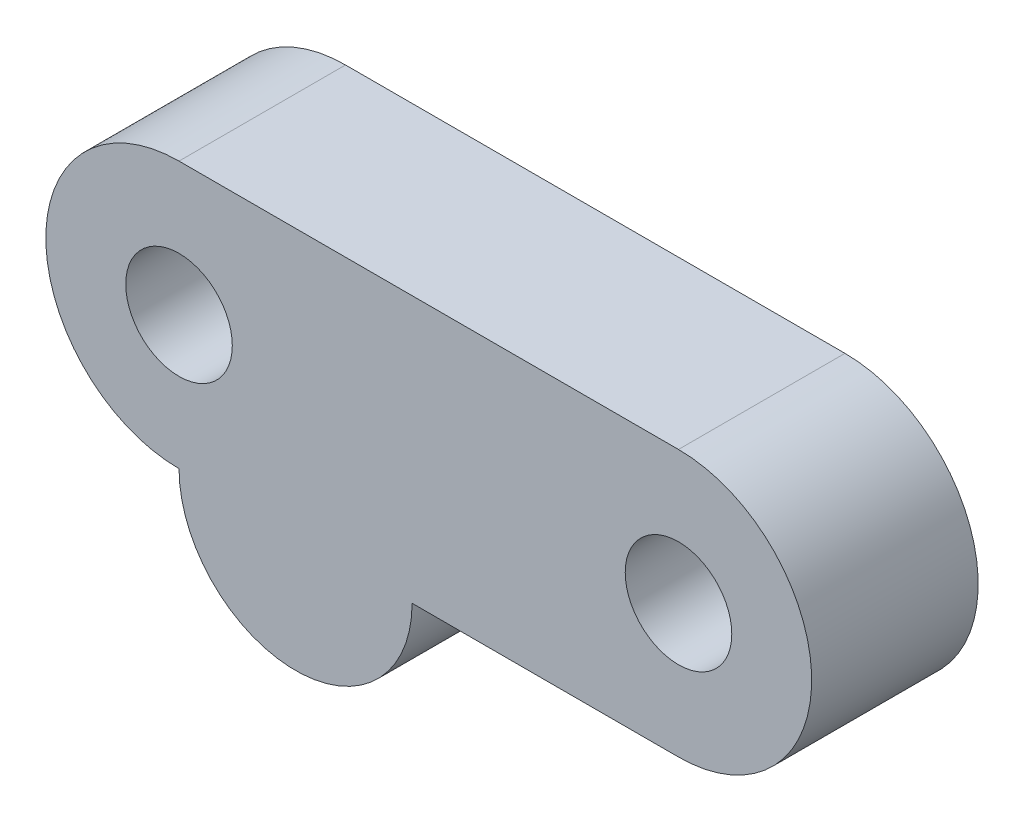
ISO-10303-21;
HEADER;
FILE_DESCRIPTION(('STEP AP214'),'2;1');
FILE_NAME('part.step','',(''),(''),'','','');
FILE_SCHEMA(('AUTOMOTIVE_DESIGN { 1 0 10303 214 1 1 1 1 }'));
ENDSEC;
DATA;
#1=APPLICATION_CONTEXT('core data for automotive mechanical design processes');
#2=APPLICATION_PROTOCOL_DEFINITION('international standard','automotive_design',2000,#1);
#3=PRODUCT_CONTEXT('',#1,'mechanical');
#4=PRODUCT('Part','Part','',(#3));
#5=PRODUCT_RELATED_PRODUCT_CATEGORY('part','',(#4));
#6=PRODUCT_DEFINITION_FORMATION('','',#4);
#7=PRODUCT_DEFINITION_CONTEXT('part definition',#1,'design');
#8=PRODUCT_DEFINITION('design','',#6,#7);
#9=PRODUCT_DEFINITION_SHAPE('','',#8);
#10=(LENGTH_UNIT() NAMED_UNIT(*) SI_UNIT(.MILLI.,.METRE.));
#11=(NAMED_UNIT(*) PLANE_ANGLE_UNIT() SI_UNIT($,.RADIAN.));
#12=(NAMED_UNIT(*) SI_UNIT($,.STERADIAN.) SOLID_ANGLE_UNIT());
#13=UNCERTAINTY_MEASURE_WITH_UNIT(LENGTH_MEASURE(1.E-05),#10,'distance_accuracy_value','');
#14=(GEOMETRIC_REPRESENTATION_CONTEXT(3) GLOBAL_UNCERTAINTY_ASSIGNED_CONTEXT((#13)) GLOBAL_UNIT_ASSIGNED_CONTEXT((#10,
#11,#12)) REPRESENTATION_CONTEXT('',''));
#15=CARTESIAN_POINT('',(0.,0.,0.));
#16=DIRECTION('',(0.,0.,1.));
#17=DIRECTION('',(1.,0.,0.));
#18=AXIS2_PLACEMENT_3D('',#15,#16,#17);
#19=CARTESIAN_POINT('',(0.,0.,5.));
#20=DIRECTION('',(0.,0.,-1.));
#21=DIRECTION('',(-1.,0.,0.));
#22=AXIS2_PLACEMENT_3D('',#19,#20,#21);
#23=CYLINDRICAL_SURFACE('',#22,1.6);
#24=CARTESIAN_POINT('',(0.,0.,5.));
#25=DIRECTION('',(0.,0.,1.));
#26=DIRECTION('',(1.,0.,0.));
#27=AXIS2_PLACEMENT_3D('',#24,#25,#26);
#28=CIRCLE('',#27,1.6);
#29=CARTESIAN_POINT('',(1.6,0.,5.));
#30=VERTEX_POINT('',#29);
#31=EDGE_CURVE('E264',#30,#30,#28,.T.);
#32=ORIENTED_EDGE('',*,*,#31,.T.);
#33=EDGE_LOOP('',(#32));
#34=FACE_BOUND('',#33,.T.);
#35=CARTESIAN_POINT('',(0.,0.,2.));
#36=DIRECTION('',(0.,0.,-1.));
#37=DIRECTION('',(-1.,0.,0.));
#38=AXIS2_PLACEMENT_3D('',#35,#36,#37);
#39=CIRCLE('',#38,1.6);
#40=CARTESIAN_POINT('',(-1.6,0.,2.));
#41=VERTEX_POINT('',#40);
#42=EDGE_CURVE('E43',#41,#41,#39,.T.);
#43=ORIENTED_EDGE('',*,*,#42,.T.);
#44=EDGE_LOOP('',(#43));
#45=FACE_BOUND('',#44,.T.);
#46=ADVANCED_FACE('F39',(#34,#45),#23,.F.);
#47=CARTESIAN_POINT('',(15.,0.,5.));
#48=DIRECTION('',(0.,0.,-1.));
#49=DIRECTION('',(-1.,0.,0.));
#50=AXIS2_PLACEMENT_3D('',#47,#48,#49);
#51=CYLINDRICAL_SURFACE('',#50,1.6);
#52=CARTESIAN_POINT('',(15.,0.,5.));
#53=DIRECTION('',(0.,0.,1.));
#54=DIRECTION('',(1.,0.,0.));
#55=AXIS2_PLACEMENT_3D('',#52,#53,#54);
#56=CIRCLE('',#55,1.6);
#57=CARTESIAN_POINT('',(16.6,0.,5.));
#58=VERTEX_POINT('',#57);
#59=EDGE_CURVE('E261',#58,#58,#56,.T.);
#60=ORIENTED_EDGE('',*,*,#59,.T.);
#61=EDGE_LOOP('',(#60));
#62=FACE_BOUND('',#61,.T.);
#63=CARTESIAN_POINT('',(15.,0.,2.));
#64=DIRECTION('',(0.,0.,-1.));
#65=DIRECTION('',(-1.,0.,0.));
#66=AXIS2_PLACEMENT_3D('',#63,#64,#65);
#67=CIRCLE('',#66,1.6);
#68=CARTESIAN_POINT('',(13.4,0.,2.));
#69=VERTEX_POINT('',#68);
#70=EDGE_CURVE('E207',#69,#69,#67,.T.);
#71=ORIENTED_EDGE('',*,*,#70,.T.);
#72=EDGE_LOOP('',(#71));
#73=FACE_BOUND('',#72,.T.);
#74=ADVANCED_FACE('F364',(#62,#73),#51,.F.);
#75=CARTESIAN_POINT('',(0.,0.,5.));
#76=DIRECTION('',(0.,0.,1.));
#77=DIRECTION('',(1.,0.,0.));
#78=AXIS2_PLACEMENT_3D('',#75,#76,#77);
#79=PLANE('',#78);
#80=ORIENTED_EDGE('',*,*,#31,.F.);
#81=EDGE_LOOP('',(#80));
#82=FACE_BOUND('',#81,.T.);
#83=CARTESIAN_POINT('',(0.,0.,5.));
#84=DIRECTION('',(0.,0.,1.));
#85=DIRECTION('',(1.,0.,0.));
#86=AXIS2_PLACEMENT_3D('',#83,#84,#85);
#87=CIRCLE('',#86,4.);
#88=CARTESIAN_POINT('',(0.,4.,5.));
#89=VERTEX_POINT('',#88);
#90=CARTESIAN_POINT('',(0.,-4.,5.));
#91=VERTEX_POINT('',#90);
#92=EDGE_CURVE('E268',#89,#91,#87,.T.);
#93=ORIENTED_EDGE('',*,*,#92,.T.);
#94=CARTESIAN_POINT('',(3.5,-4.,5.));
#95=DIRECTION('',(0.,0.,1.));
#96=DIRECTION('',(1.,0.,0.));
#97=AXIS2_PLACEMENT_3D('',#94,#95,#96);
#98=CIRCLE('',#97,3.5);
#99=CARTESIAN_POINT('',(7.,-4.,5.));
#100=VERTEX_POINT('',#99);
#101=EDGE_CURVE('E271',#91,#100,#98,.T.);
#102=ORIENTED_EDGE('',*,*,#101,.T.);
#103=DIRECTION('',(1.,0.,0.));
#104=VECTOR('',#103,1.);
#105=CARTESIAN_POINT('',(7.,-4.,5.));
#106=LINE('',#105,#104);
#107=CARTESIAN_POINT('',(15.,-4.,5.));
#108=VERTEX_POINT('',#107);
#109=EDGE_CURVE('E274',#100,#108,#106,.T.);
#110=ORIENTED_EDGE('',*,*,#109,.T.);
#111=CARTESIAN_POINT('',(15.,0.,5.));
#112=DIRECTION('',(0.,0.,1.));
#113=DIRECTION('',(1.,0.,0.));
#114=AXIS2_PLACEMENT_3D('',#111,#112,#113);
#115=CIRCLE('',#114,4.);
#116=CARTESIAN_POINT('',(15.,4.,5.));
#117=VERTEX_POINT('',#116);
#118=EDGE_CURVE('E276',#108,#117,#115,.T.);
#119=ORIENTED_EDGE('',*,*,#118,.T.);
#120=DIRECTION('',(-1.,0.,0.));
#121=VECTOR('',#120,1.);
#122=CARTESIAN_POINT('',(0.,4.,5.));
#123=LINE('',#122,#121);
#124=EDGE_CURVE('E278',#117,#89,#123,.T.);
#125=ORIENTED_EDGE('',*,*,#124,.T.);
#126=EDGE_LOOP('',(#93,#102,#110,#119,#125));
#127=FACE_BOUND('',#126,.T.);
#128=ORIENTED_EDGE('',*,*,#59,.F.);
#129=EDGE_LOOP('',(#128));
#130=FACE_BOUND('',#129,.T.);
#131=ADVANCED_FACE('F336',(#82,#127,#130),#79,.T.);
#132=CARTESIAN_POINT('',(0.,0.,0.));
#133=DIRECTION('',(0.,0.,1.));
#134=DIRECTION('',(1.,0.,0.));
#135=AXIS2_PLACEMENT_3D('',#132,#133,#134);
#136=PLANE('',#135);
#137=DIRECTION('',(0.5,0.866025403784439,0.));
#138=VECTOR('',#137,1.);
#139=CARTESIAN_POINT('',(11.5358983848622,0.,0.));
#140=LINE('',#139,#138);
#141=CARTESIAN_POINT('',(11.5358983848622,0.,0.));
#142=VERTEX_POINT('',#141);
#143=CARTESIAN_POINT('',(13.2679491924311,3.,0.));
#144=VERTEX_POINT('',#143);
#145=EDGE_CURVE('E195',#142,#144,#140,.T.);
#146=ORIENTED_EDGE('',*,*,#145,.F.);
#147=DIRECTION('',(-0.5,0.866025403784439,0.));
#148=VECTOR('',#147,1.);
#149=CARTESIAN_POINT('',(13.2679491924311,-3.,0.));
#150=LINE('',#149,#148);
#151=CARTESIAN_POINT('',(13.2679491924311,-3.,0.));
#152=VERTEX_POINT('',#151);
#153=EDGE_CURVE('E56',#152,#142,#150,.T.);
#154=ORIENTED_EDGE('',*,*,#153,.F.);
#155=DIRECTION('',(-1.,0.,0.));
#156=VECTOR('',#155,1.);
#157=CARTESIAN_POINT('',(16.7320508075689,-3.,0.));
#158=LINE('',#157,#156);
#159=CARTESIAN_POINT('',(16.7320508075689,-3.,0.));
#160=VERTEX_POINT('',#159);
#161=EDGE_CURVE('E181',#160,#152,#158,.T.);
#162=ORIENTED_EDGE('',*,*,#161,.F.);
#163=DIRECTION('',(-0.500000000000001,-0.866025403784438,0.));
#164=VECTOR('',#163,1.);
#165=CARTESIAN_POINT('',(18.4641016151377,0.,0.));
#166=LINE('',#165,#164);
#167=CARTESIAN_POINT('',(18.4641016151377,0.,0.));
#168=VERTEX_POINT('',#167);
#169=EDGE_CURVE('E184',#168,#160,#166,.T.);
#170=ORIENTED_EDGE('',*,*,#169,.F.);
#171=DIRECTION('',(0.500000000000001,-0.866025403784438,0.));
#172=VECTOR('',#171,1.);
#173=CARTESIAN_POINT('',(16.7320508075689,3.,0.));
#174=LINE('',#173,#172);
#175=CARTESIAN_POINT('',(16.7320508075689,3.,0.));
#176=VERTEX_POINT('',#175);
#177=EDGE_CURVE('E200',#176,#168,#174,.T.);
#178=ORIENTED_EDGE('',*,*,#177,.F.);
#179=DIRECTION('',(1.,0.,0.));
#180=VECTOR('',#179,1.);
#181=CARTESIAN_POINT('',(13.2679491924311,3.,0.));
#182=LINE('',#181,#180);
#183=EDGE_CURVE('E197',#144,#176,#182,.T.);
#184=ORIENTED_EDGE('',*,*,#183,.F.);
#185=EDGE_LOOP('',(#146,#154,#162,#170,#178,#184));
#186=FACE_BOUND('',#185,.T.);
#187=DIRECTION('',(0.5,0.866025403784438,0.));
#188=VECTOR('',#187,1.);
#189=CARTESIAN_POINT('',(-3.46410161513775,0.,0.));
#190=LINE('',#189,#188);
#191=CARTESIAN_POINT('',(-3.46410161513775,0.,0.));
#192=VERTEX_POINT('',#191);
#193=CARTESIAN_POINT('',(-1.73205080756888,3.,0.));
#194=VERTEX_POINT('',#193);
#195=EDGE_CURVE('E241',#192,#194,#190,.T.);
#196=ORIENTED_EDGE('',*,*,#195,.F.);
#197=DIRECTION('',(-0.5,0.866025403784439,0.));
#198=VECTOR('',#197,1.);
#199=CARTESIAN_POINT('',(-1.73205080756888,-3.,0.));
#200=LINE('',#199,#198);
#201=CARTESIAN_POINT('',(-1.73205080756888,-3.,0.));
#202=VERTEX_POINT('',#201);
#203=EDGE_CURVE('E64',#202,#192,#200,.T.);
#204=ORIENTED_EDGE('',*,*,#203,.F.);
#205=DIRECTION('',(-1.,0.,0.));
#206=VECTOR('',#205,1.);
#207=CARTESIAN_POINT('',(1.73205080756888,-3.,0.));
#208=LINE('',#207,#206);
#209=CARTESIAN_POINT('',(1.73205080756888,-3.,0.));
#210=VERTEX_POINT('',#209);
#211=EDGE_CURVE('E228',#210,#202,#208,.T.);
#212=ORIENTED_EDGE('',*,*,#211,.F.);
#213=DIRECTION('',(-0.5,-0.866025403784438,0.));
#214=VECTOR('',#213,1.);
#215=CARTESIAN_POINT('',(3.46410161513776,0.,0.));
#216=LINE('',#215,#214);
#217=CARTESIAN_POINT('',(3.46410161513776,0.,0.));
#218=VERTEX_POINT('',#217);
#219=EDGE_CURVE('E231',#218,#210,#216,.T.);
#220=ORIENTED_EDGE('',*,*,#219,.F.);
#221=DIRECTION('',(0.5,-0.866025403784439,0.));
#222=VECTOR('',#221,1.);
#223=CARTESIAN_POINT('',(1.73205080756888,3.,0.));
#224=LINE('',#223,#222);
#225=CARTESIAN_POINT('',(1.73205080756888,3.,0.));
#226=VERTEX_POINT('',#225);
#227=EDGE_CURVE('E235',#226,#218,#224,.T.);
#228=ORIENTED_EDGE('',*,*,#227,.F.);
#229=DIRECTION('',(1.,0.,0.));
#230=VECTOR('',#229,1.);
#231=CARTESIAN_POINT('',(-1.73205080756888,3.,0.));
#232=LINE('',#231,#230);
#233=EDGE_CURVE('E238',#194,#226,#232,.T.);
#234=ORIENTED_EDGE('',*,*,#233,.F.);
#235=EDGE_LOOP('',(#196,#204,#212,#220,#228,#234));
#236=FACE_BOUND('',#235,.T.);
#237=CARTESIAN_POINT('',(0.,0.,0.));
#238=DIRECTION('',(0.,0.,1.));
#239=DIRECTION('',(1.,0.,0.));
#240=AXIS2_PLACEMENT_3D('',#237,#238,#239);
#241=CIRCLE('',#240,4.);
#242=CARTESIAN_POINT('',(0.,4.,0.));
#243=VERTEX_POINT('',#242);
#244=CARTESIAN_POINT('',(0.,-4.,0.));
#245=VERTEX_POINT('',#244);
#246=EDGE_CURVE('E267',#243,#245,#241,.T.);
#247=ORIENTED_EDGE('',*,*,#246,.F.);
#248=DIRECTION('',(-1.,0.,0.));
#249=VECTOR('',#248,1.);
#250=CARTESIAN_POINT('',(0.,4.,0.));
#251=LINE('',#250,#249);
#252=CARTESIAN_POINT('',(15.,4.,0.));
#253=VERTEX_POINT('',#252);
#254=EDGE_CURVE('E272',#253,#243,#251,.T.);
#255=ORIENTED_EDGE('',*,*,#254,.F.);
#256=CARTESIAN_POINT('',(15.,0.,0.));
#257=DIRECTION('',(0.,0.,1.));
#258=DIRECTION('',(1.,0.,0.));
#259=AXIS2_PLACEMENT_3D('',#256,#257,#258);
#260=CIRCLE('',#259,4.);
#261=CARTESIAN_POINT('',(15.,-4.,0.));
#262=VERTEX_POINT('',#261);
#263=EDGE_CURVE('E287',#262,#253,#260,.T.);
#264=ORIENTED_EDGE('',*,*,#263,.F.);
#265=DIRECTION('',(1.,0.,0.));
#266=VECTOR('',#265,1.);
#267=CARTESIAN_POINT('',(7.,-4.,0.));
#268=LINE('',#267,#266);
#269=CARTESIAN_POINT('',(7.,-4.,0.));
#270=VERTEX_POINT('',#269);
#271=EDGE_CURVE('E285',#270,#262,#268,.T.);
#272=ORIENTED_EDGE('',*,*,#271,.F.);
#273=CARTESIAN_POINT('',(3.5,-4.,0.));
#274=DIRECTION('',(0.,0.,1.));
#275=DIRECTION('',(1.,0.,0.));
#276=AXIS2_PLACEMENT_3D('',#273,#274,#275);
#277=CIRCLE('',#276,3.5);
#278=EDGE_CURVE('E283',#245,#270,#277,.T.);
#279=ORIENTED_EDGE('',*,*,#278,.F.);
#280=EDGE_LOOP('',(#247,#255,#264,#272,#279));
#281=FACE_BOUND('',#280,.T.);
#282=ADVANCED_FACE('F333',(#186,#236,#281),#136,.F.);
#283=CARTESIAN_POINT('',(0.,0.,5.));
#284=DIRECTION('',(0.,0.,-1.));
#285=DIRECTION('',(-1.,0.,0.));
#286=AXIS2_PLACEMENT_3D('',#283,#284,#285);
#287=CYLINDRICAL_SURFACE('',#286,4.);
#288=ORIENTED_EDGE('',*,*,#246,.T.);
#289=DIRECTION('',(0.,0.,-1.));
#290=VECTOR('',#289,1.);
#291=CARTESIAN_POINT('',(0.,-4.,5.));
#292=LINE('',#291,#290);
#293=EDGE_CURVE('E11',#91,#245,#292,.T.);
#294=ORIENTED_EDGE('',*,*,#293,.F.);
#295=ORIENTED_EDGE('',*,*,#92,.F.);
#296=DIRECTION('',(0.,0.,-1.));
#297=VECTOR('',#296,1.);
#298=CARTESIAN_POINT('',(0.,4.,5.));
#299=LINE('',#298,#297);
#300=EDGE_CURVE('E280',#89,#243,#299,.T.);
#301=ORIENTED_EDGE('',*,*,#300,.T.);
#302=EDGE_LOOP('',(#288,#294,#295,#301));
#303=FACE_BOUND('',#302,.T.);
#304=ADVANCED_FACE('F41',(#303),#287,.T.);
#305=CARTESIAN_POINT('',(3.5,-4.,5.));
#306=DIRECTION('',(0.,0.,-1.));
#307=DIRECTION('',(-1.,0.,0.));
#308=AXIS2_PLACEMENT_3D('',#305,#306,#307);
#309=CYLINDRICAL_SURFACE('',#308,3.5);
#310=ORIENTED_EDGE('',*,*,#278,.T.);
#311=DIRECTION('',(0.,0.,-1.));
#312=VECTOR('',#311,1.);
#313=CARTESIAN_POINT('',(7.,-4.,5.));
#314=LINE('',#313,#312);
#315=EDGE_CURVE('E48',#100,#270,#314,.T.);
#316=ORIENTED_EDGE('',*,*,#315,.F.);
#317=ORIENTED_EDGE('',*,*,#101,.F.);
#318=ORIENTED_EDGE('',*,*,#293,.T.);
#319=EDGE_LOOP('',(#310,#316,#317,#318));
#320=FACE_BOUND('',#319,.T.);
#321=ADVANCED_FACE('F360',(#320),#309,.T.);
#322=CARTESIAN_POINT('',(7.,-4.,5.));
#323=DIRECTION('',(0.,1.,0.));
#324=DIRECTION('',(0.,0.,1.));
#325=AXIS2_PLACEMENT_3D('',#322,#323,#324);
#326=PLANE('',#325);
#327=ORIENTED_EDGE('',*,*,#271,.T.);
#328=DIRECTION('',(0.,0.,-1.));
#329=VECTOR('',#328,1.);
#330=CARTESIAN_POINT('',(15.,-4.,5.));
#331=LINE('',#330,#329);
#332=EDGE_CURVE('E295',#108,#262,#331,.T.);
#333=ORIENTED_EDGE('',*,*,#332,.F.);
#334=ORIENTED_EDGE('',*,*,#109,.F.);
#335=ORIENTED_EDGE('',*,*,#315,.T.);
#336=EDGE_LOOP('',(#327,#333,#334,#335));
#337=FACE_BOUND('',#336,.T.);
#338=ADVANCED_FACE('F356',(#337),#326,.F.);
#339=CARTESIAN_POINT('',(15.,0.,5.));
#340=DIRECTION('',(0.,0.,-1.));
#341=DIRECTION('',(-1.,0.,0.));
#342=AXIS2_PLACEMENT_3D('',#339,#340,#341);
#343=CYLINDRICAL_SURFACE('',#342,4.);
#344=ORIENTED_EDGE('',*,*,#263,.T.);
#345=DIRECTION('',(0.,0.,-1.));
#346=VECTOR('',#345,1.);
#347=CARTESIAN_POINT('',(15.,4.,5.));
#348=LINE('',#347,#346);
#349=EDGE_CURVE('E292',#117,#253,#348,.T.);
#350=ORIENTED_EDGE('',*,*,#349,.F.);
#351=ORIENTED_EDGE('',*,*,#118,.F.);
#352=ORIENTED_EDGE('',*,*,#332,.T.);
#353=EDGE_LOOP('',(#344,#350,#351,#352));
#354=FACE_BOUND('',#353,.T.);
#355=ADVANCED_FACE('F353',(#354),#343,.T.);
#356=CARTESIAN_POINT('',(0.,4.,5.));
#357=DIRECTION('',(0.,-1.,0.));
#358=DIRECTION('',(0.,0.,-1.));
#359=AXIS2_PLACEMENT_3D('',#356,#357,#358);
#360=PLANE('',#359);
#361=ORIENTED_EDGE('',*,*,#254,.T.);
#362=ORIENTED_EDGE('',*,*,#300,.F.);
#363=ORIENTED_EDGE('',*,*,#124,.F.);
#364=ORIENTED_EDGE('',*,*,#349,.T.);
#365=EDGE_LOOP('',(#361,#362,#363,#364));
#366=FACE_BOUND('',#365,.T.);
#367=ADVANCED_FACE('F349',(#366),#360,.F.);
#368=CARTESIAN_POINT('',(13.2679491924311,-3.,2.));
#369=DIRECTION('',(-0.866025403784439,-0.5,0.));
#370=DIRECTION('',(0.5,-0.866025403784439,0.));
#371=AXIS2_PLACEMENT_3D('',#368,#369,#370);
#372=PLANE('',#371);
#373=ORIENTED_EDGE('',*,*,#153,.T.);
#374=DIRECTION('',(0.,0.,-1.));
#375=VECTOR('',#374,1.);
#376=CARTESIAN_POINT('',(11.5358983848622,0.,2.));
#377=LINE('',#376,#375);
#378=CARTESIAN_POINT('',(11.5358983848622,0.,2.));
#379=VERTEX_POINT('',#378);
#380=EDGE_CURVE('E158',#379,#142,#377,.T.);
#381=ORIENTED_EDGE('',*,*,#380,.F.);
#382=DIRECTION('',(-0.5,0.866025403784439,0.));
#383=VECTOR('',#382,1.);
#384=CARTESIAN_POINT('',(13.2679491924311,-3.,2.));
#385=LINE('',#384,#383);
#386=CARTESIAN_POINT('',(13.2679491924311,-3.,2.));
#387=VERTEX_POINT('',#386);
#388=EDGE_CURVE('E162',#387,#379,#385,.T.);
#389=ORIENTED_EDGE('',*,*,#388,.F.);
#390=DIRECTION('',(0.,0.,-1.));
#391=VECTOR('',#390,1.);
#392=CARTESIAN_POINT('',(13.2679491924311,-3.,2.));
#393=LINE('',#392,#391);
#394=EDGE_CURVE('E205',#387,#152,#393,.T.);
#395=ORIENTED_EDGE('',*,*,#394,.T.);
#396=EDGE_LOOP('',(#373,#381,#389,#395));
#397=FACE_BOUND('',#396,.T.);
#398=ADVANCED_FACE('F160',(#397),#372,.F.);
#399=CARTESIAN_POINT('',(16.7320508075689,-3.,2.));
#400=DIRECTION('',(0.,-1.,0.));
#401=DIRECTION('',(0.,0.,-1.));
#402=AXIS2_PLACEMENT_3D('',#399,#400,#401);
#403=PLANE('',#402);
#404=ORIENTED_EDGE('',*,*,#161,.T.);
#405=ORIENTED_EDGE('',*,*,#394,.F.);
#406=DIRECTION('',(-1.,0.,0.));
#407=VECTOR('',#406,1.);
#408=CARTESIAN_POINT('',(16.7320508075689,-3.,2.));
#409=LINE('',#408,#407);
#410=CARTESIAN_POINT('',(16.7320508075689,-3.,2.));
#411=VERTEX_POINT('',#410);
#412=EDGE_CURVE('E168',#411,#387,#409,.T.);
#413=ORIENTED_EDGE('',*,*,#412,.F.);
#414=DIRECTION('',(0.,0.,-1.));
#415=VECTOR('',#414,1.);
#416=CARTESIAN_POINT('',(16.7320508075689,-3.,2.));
#417=LINE('',#416,#415);
#418=EDGE_CURVE('E208',#411,#160,#417,.T.);
#419=ORIENTED_EDGE('',*,*,#418,.T.);
#420=EDGE_LOOP('',(#404,#405,#413,#419));
#421=FACE_BOUND('',#420,.T.);
#422=ADVANCED_FACE('F408',(#421),#403,.F.);
#423=CARTESIAN_POINT('',(18.4641016151377,0.,2.));
#424=DIRECTION('',(0.866025403784438,-0.500000000000001,0.));
#425=DIRECTION('',(0.500000000000001,0.866025403784438,0.));
#426=AXIS2_PLACEMENT_3D('',#423,#424,#425);
#427=PLANE('',#426);
#428=ORIENTED_EDGE('',*,*,#169,.T.);
#429=ORIENTED_EDGE('',*,*,#418,.F.);
#430=DIRECTION('',(-0.500000000000001,-0.866025403784438,0.));
#431=VECTOR('',#430,1.);
#432=CARTESIAN_POINT('',(18.4641016151377,0.,2.));
#433=LINE('',#432,#431);
#434=CARTESIAN_POINT('',(18.4641016151377,0.,2.));
#435=VERTEX_POINT('',#434);
#436=EDGE_CURVE('E191',#435,#411,#433,.T.);
#437=ORIENTED_EDGE('',*,*,#436,.F.);
#438=DIRECTION('',(0.,0.,-1.));
#439=VECTOR('',#438,1.);
#440=CARTESIAN_POINT('',(18.4641016151377,0.,2.));
#441=LINE('',#440,#439);
#442=EDGE_CURVE('E210',#435,#168,#441,.T.);
#443=ORIENTED_EDGE('',*,*,#442,.T.);
#444=EDGE_LOOP('',(#428,#429,#437,#443));
#445=FACE_BOUND('',#444,.T.);
#446=ADVANCED_FACE('F417',(#445),#427,.F.);
#447=CARTESIAN_POINT('',(16.7320508075689,3.,2.));
#448=DIRECTION('',(0.866025403784438,0.500000000000001,0.));
#449=DIRECTION('',(-0.500000000000001,0.866025403784438,0.));
#450=AXIS2_PLACEMENT_3D('',#447,#448,#449);
#451=PLANE('',#450);
#452=ORIENTED_EDGE('',*,*,#177,.T.);
#453=ORIENTED_EDGE('',*,*,#442,.F.);
#454=DIRECTION('',(0.500000000000001,-0.866025403784438,0.));
#455=VECTOR('',#454,1.);
#456=CARTESIAN_POINT('',(16.7320508075689,3.,2.));
#457=LINE('',#456,#455);
#458=CARTESIAN_POINT('',(16.7320508075689,3.,2.));
#459=VERTEX_POINT('',#458);
#460=EDGE_CURVE('E188',#459,#435,#457,.T.);
#461=ORIENTED_EDGE('',*,*,#460,.F.);
#462=DIRECTION('',(0.,0.,-1.));
#463=VECTOR('',#462,1.);
#464=CARTESIAN_POINT('',(16.7320508075689,3.,2.));
#465=LINE('',#464,#463);
#466=EDGE_CURVE('E212',#459,#176,#465,.T.);
#467=ORIENTED_EDGE('',*,*,#466,.T.);
#468=EDGE_LOOP('',(#452,#453,#461,#467));
#469=FACE_BOUND('',#468,.T.);
#470=ADVANCED_FACE('F426',(#469),#451,.F.);
#471=CARTESIAN_POINT('',(13.2679491924311,3.,2.));
#472=DIRECTION('',(0.,1.,0.));
#473=DIRECTION('',(-1.,0.,0.));
#474=AXIS2_PLACEMENT_3D('',#471,#472,#473);
#475=PLANE('',#474);
#476=ORIENTED_EDGE('',*,*,#183,.T.);
#477=ORIENTED_EDGE('',*,*,#466,.F.);
#478=DIRECTION('',(1.,0.,0.));
#479=VECTOR('',#478,1.);
#480=CARTESIAN_POINT('',(13.2679491924311,3.,2.));
#481=LINE('',#480,#479);
#482=CARTESIAN_POINT('',(13.2679491924311,3.,2.));
#483=VERTEX_POINT('',#482);
#484=EDGE_CURVE('E176',#483,#459,#481,.T.);
#485=ORIENTED_EDGE('',*,*,#484,.F.);
#486=DIRECTION('',(0.,0.,-1.));
#487=VECTOR('',#486,1.);
#488=CARTESIAN_POINT('',(13.2679491924311,3.,2.));
#489=LINE('',#488,#487);
#490=EDGE_CURVE('E167',#483,#144,#489,.T.);
#491=ORIENTED_EDGE('',*,*,#490,.T.);
#492=EDGE_LOOP('',(#476,#477,#485,#491));
#493=FACE_BOUND('',#492,.T.);
#494=ADVANCED_FACE('F435',(#493),#475,.F.);
#495=CARTESIAN_POINT('',(11.5358983848622,0.,2.));
#496=DIRECTION('',(-0.866025403784439,0.5,0.));
#497=DIRECTION('',(-0.5,-0.866025403784439,0.));
#498=AXIS2_PLACEMENT_3D('',#495,#496,#497);
#499=PLANE('',#498);
#500=ORIENTED_EDGE('',*,*,#145,.T.);
#501=ORIENTED_EDGE('',*,*,#490,.F.);
#502=DIRECTION('',(0.5,0.866025403784439,0.));
#503=VECTOR('',#502,1.);
#504=CARTESIAN_POINT('',(11.5358983848622,0.,2.));
#505=LINE('',#504,#503);
#506=EDGE_CURVE('E171',#379,#483,#505,.T.);
#507=ORIENTED_EDGE('',*,*,#506,.F.);
#508=ORIENTED_EDGE('',*,*,#380,.T.);
#509=EDGE_LOOP('',(#500,#501,#507,#508));
#510=FACE_BOUND('',#509,.T.);
#511=ADVANCED_FACE('F172',(#510),#499,.F.);
#512=CARTESIAN_POINT('',(0.,0.,2.));
#513=DIRECTION('',(0.,0.,-1.));
#514=DIRECTION('',(-1.,0.,0.));
#515=AXIS2_PLACEMENT_3D('',#512,#513,#514);
#516=PLANE('',#515);
#517=ORIENTED_EDGE('',*,*,#70,.F.);
#518=EDGE_LOOP('',(#517));
#519=FACE_BOUND('',#518,.T.);
#520=ORIENTED_EDGE('',*,*,#388,.T.);
#521=ORIENTED_EDGE('',*,*,#506,.T.);
#522=ORIENTED_EDGE('',*,*,#484,.T.);
#523=ORIENTED_EDGE('',*,*,#460,.T.);
#524=ORIENTED_EDGE('',*,*,#436,.T.);
#525=ORIENTED_EDGE('',*,*,#412,.T.);
#526=EDGE_LOOP('',(#520,#521,#522,#523,#524,#525));
#527=FACE_BOUND('',#526,.T.);
#528=ADVANCED_FACE('F178',(#519,#527),#516,.T.);
#529=CARTESIAN_POINT('',(-1.73205080756888,-3.,2.));
#530=DIRECTION('',(-0.866025403784439,-0.5,0.));
#531=DIRECTION('',(0.5,-0.866025403784439,0.));
#532=AXIS2_PLACEMENT_3D('',#529,#530,#531);
#533=PLANE('',#532);
#534=ORIENTED_EDGE('',*,*,#203,.T.);
#535=DIRECTION('',(0.,0.,-1.));
#536=VECTOR('',#535,1.);
#537=CARTESIAN_POINT('',(-3.46410161513775,0.,2.));
#538=LINE('',#537,#536);
#539=CARTESIAN_POINT('',(-3.46410161513775,0.,2.));
#540=VERTEX_POINT('',#539);
#541=EDGE_CURVE('E215',#540,#192,#538,.T.);
#542=ORIENTED_EDGE('',*,*,#541,.F.);
#543=DIRECTION('',(-0.5,0.866025403784439,0.));
#544=VECTOR('',#543,1.);
#545=CARTESIAN_POINT('',(-1.73205080756888,-3.,2.));
#546=LINE('',#545,#544);
#547=CARTESIAN_POINT('',(-1.73205080756888,-3.,2.));
#548=VERTEX_POINT('',#547);
#549=EDGE_CURVE('E232',#548,#540,#546,.T.);
#550=ORIENTED_EDGE('',*,*,#549,.F.);
#551=DIRECTION('',(0.,0.,-1.));
#552=VECTOR('',#551,1.);
#553=CARTESIAN_POINT('',(-1.73205080756888,-3.,2.));
#554=LINE('',#553,#552);
#555=EDGE_CURVE('E226',#548,#202,#554,.T.);
#556=ORIENTED_EDGE('',*,*,#555,.T.);
#557=EDGE_LOOP('',(#534,#542,#550,#556));
#558=FACE_BOUND('',#557,.T.);
#559=ADVANCED_FACE('F314',(#558),#533,.F.);
#560=CARTESIAN_POINT('',(1.73205080756888,-3.,2.));
#561=DIRECTION('',(0.,-1.,0.));
#562=DIRECTION('',(1.,0.,0.));
#563=AXIS2_PLACEMENT_3D('',#560,#561,#562);
#564=PLANE('',#563);
#565=ORIENTED_EDGE('',*,*,#211,.T.);
#566=ORIENTED_EDGE('',*,*,#555,.F.);
#567=DIRECTION('',(-1.,0.,0.));
#568=VECTOR('',#567,1.);
#569=CARTESIAN_POINT('',(1.73205080756888,-3.,2.));
#570=LINE('',#569,#568);
#571=CARTESIAN_POINT('',(1.73205080756888,-3.,2.));
#572=VERTEX_POINT('',#571);
#573=EDGE_CURVE('E217',#572,#548,#570,.T.);
#574=ORIENTED_EDGE('',*,*,#573,.F.);
#575=DIRECTION('',(0.,0.,-1.));
#576=VECTOR('',#575,1.);
#577=CARTESIAN_POINT('',(1.73205080756888,-3.,2.));
#578=LINE('',#577,#576);
#579=EDGE_CURVE('E224',#572,#210,#578,.T.);
#580=ORIENTED_EDGE('',*,*,#579,.T.);
#581=EDGE_LOOP('',(#565,#566,#574,#580));
#582=FACE_BOUND('',#581,.T.);
#583=ADVANCED_FACE('F331',(#582),#564,.F.);
#584=CARTESIAN_POINT('',(3.46410161513776,0.,2.));
#585=DIRECTION('',(0.866025403784439,-0.5,0.));
#586=DIRECTION('',(0.5,0.866025403784438,0.));
#587=AXIS2_PLACEMENT_3D('',#584,#585,#586);
#588=PLANE('',#587);
#589=ORIENTED_EDGE('',*,*,#219,.T.);
#590=ORIENTED_EDGE('',*,*,#579,.F.);
#591=DIRECTION('',(-0.5,-0.866025403784438,0.));
#592=VECTOR('',#591,1.);
#593=CARTESIAN_POINT('',(3.46410161513776,0.,2.));
#594=LINE('',#593,#592);
#595=CARTESIAN_POINT('',(3.46410161513776,0.,2.));
#596=VERTEX_POINT('',#595);
#597=EDGE_CURVE('E247',#596,#572,#594,.T.);
#598=ORIENTED_EDGE('',*,*,#597,.F.);
#599=DIRECTION('',(0.,0.,-1.));
#600=VECTOR('',#599,1.);
#601=CARTESIAN_POINT('',(3.46410161513776,0.,2.));
#602=LINE('',#601,#600);
#603=EDGE_CURVE('E222',#596,#218,#602,.T.);
#604=ORIENTED_EDGE('',*,*,#603,.T.);
#605=EDGE_LOOP('',(#589,#590,#598,#604));
#606=FACE_BOUND('',#605,.T.);
#607=ADVANCED_FACE('F328',(#606),#588,.F.);
#608=CARTESIAN_POINT('',(1.73205080756888,3.,2.));
#609=DIRECTION('',(0.866025403784439,0.5,0.));
#610=DIRECTION('',(-0.5,0.866025403784439,0.));
#611=AXIS2_PLACEMENT_3D('',#608,#609,#610);
#612=PLANE('',#611);
#613=ORIENTED_EDGE('',*,*,#227,.T.);
#614=ORIENTED_EDGE('',*,*,#603,.F.);
#615=DIRECTION('',(0.5,-0.866025403784439,0.));
#616=VECTOR('',#615,1.);
#617=CARTESIAN_POINT('',(1.73205080756888,3.,2.));
#618=LINE('',#617,#616);
#619=CARTESIAN_POINT('',(1.73205080756888,3.,2.));
#620=VERTEX_POINT('',#619);
#621=EDGE_CURVE('E250',#620,#596,#618,.T.);
#622=ORIENTED_EDGE('',*,*,#621,.F.);
#623=DIRECTION('',(0.,0.,-1.));
#624=VECTOR('',#623,1.);
#625=CARTESIAN_POINT('',(1.73205080756888,3.,2.));
#626=LINE('',#625,#624);
#627=EDGE_CURVE('E220',#620,#226,#626,.T.);
#628=ORIENTED_EDGE('',*,*,#627,.T.);
#629=EDGE_LOOP('',(#613,#614,#622,#628));
#630=FACE_BOUND('',#629,.T.);
#631=ADVANCED_FACE('F324',(#630),#612,.F.);
#632=CARTESIAN_POINT('',(-1.73205080756888,3.,2.));
#633=DIRECTION('',(0.,1.,0.));
#634=DIRECTION('',(-1.,0.,0.));
#635=AXIS2_PLACEMENT_3D('',#632,#633,#634);
#636=PLANE('',#635);
#637=ORIENTED_EDGE('',*,*,#233,.T.);
#638=ORIENTED_EDGE('',*,*,#627,.F.);
#639=DIRECTION('',(1.,0.,0.));
#640=VECTOR('',#639,1.);
#641=CARTESIAN_POINT('',(-1.73205080756888,3.,2.));
#642=LINE('',#641,#640);
#643=CARTESIAN_POINT('',(-1.73205080756888,3.,2.));
#644=VERTEX_POINT('',#643);
#645=EDGE_CURVE('E253',#644,#620,#642,.T.);
#646=ORIENTED_EDGE('',*,*,#645,.F.);
#647=DIRECTION('',(0.,0.,-1.));
#648=VECTOR('',#647,1.);
#649=CARTESIAN_POINT('',(-1.73205080756888,3.,2.));
#650=LINE('',#649,#648);
#651=EDGE_CURVE('E218',#644,#194,#650,.T.);
#652=ORIENTED_EDGE('',*,*,#651,.T.);
#653=EDGE_LOOP('',(#637,#638,#646,#652));
#654=FACE_BOUND('',#653,.T.);
#655=ADVANCED_FACE('F320',(#654),#636,.F.);
#656=CARTESIAN_POINT('',(-3.46410161513775,0.,2.));
#657=DIRECTION('',(-0.866025403784438,0.5,0.));
#658=DIRECTION('',(-0.5,-0.866025403784439,0.));
#659=AXIS2_PLACEMENT_3D('',#656,#657,#658);
#660=PLANE('',#659);
#661=ORIENTED_EDGE('',*,*,#195,.T.);
#662=ORIENTED_EDGE('',*,*,#651,.F.);
#663=DIRECTION('',(0.5,0.866025403784438,0.));
#664=VECTOR('',#663,1.);
#665=CARTESIAN_POINT('',(-3.46410161513775,0.,2.));
#666=LINE('',#665,#664);
#667=EDGE_CURVE('E256',#540,#644,#666,.T.);
#668=ORIENTED_EDGE('',*,*,#667,.F.);
#669=ORIENTED_EDGE('',*,*,#541,.T.);
#670=EDGE_LOOP('',(#661,#662,#668,#669));
#671=FACE_BOUND('',#670,.T.);
#672=ADVANCED_FACE('F309',(#671),#660,.F.);
#673=CARTESIAN_POINT('',(0.,0.,2.));
#674=DIRECTION('',(0.,0.,-1.));
#675=DIRECTION('',(-1.,0.,0.));
#676=AXIS2_PLACEMENT_3D('',#673,#674,#675);
#677=PLANE('',#676);
#678=ORIENTED_EDGE('',*,*,#42,.F.);
#679=EDGE_LOOP('',(#678));
#680=FACE_BOUND('',#679,.T.);
#681=ORIENTED_EDGE('',*,*,#549,.T.);
#682=ORIENTED_EDGE('',*,*,#667,.T.);
#683=ORIENTED_EDGE('',*,*,#645,.T.);
#684=ORIENTED_EDGE('',*,*,#621,.T.);
#685=ORIENTED_EDGE('',*,*,#597,.T.);
#686=ORIENTED_EDGE('',*,*,#573,.T.);
#687=EDGE_LOOP('',(#681,#682,#683,#684,#685,#686));
#688=FACE_BOUND('',#687,.T.);
#689=ADVANCED_FACE('F306',(#680,#688),#677,.T.);
#690=CLOSED_SHELL('',(#46,#74,#131,#282,#304,#321,#338,#355,#367,#398,#422,#446,#470,#494,#511,
#528,#559,#583,#607,#631,#655,#672,#689));
#691=MANIFOLD_SOLID_BREP('B2',#690);
#692=ADVANCED_BREP_SHAPE_REPRESENTATION('',(#18,#691),#14);
#693=SHAPE_DEFINITION_REPRESENTATION(#9,#692);
ENDSEC;
END-ISO-10303-21;
